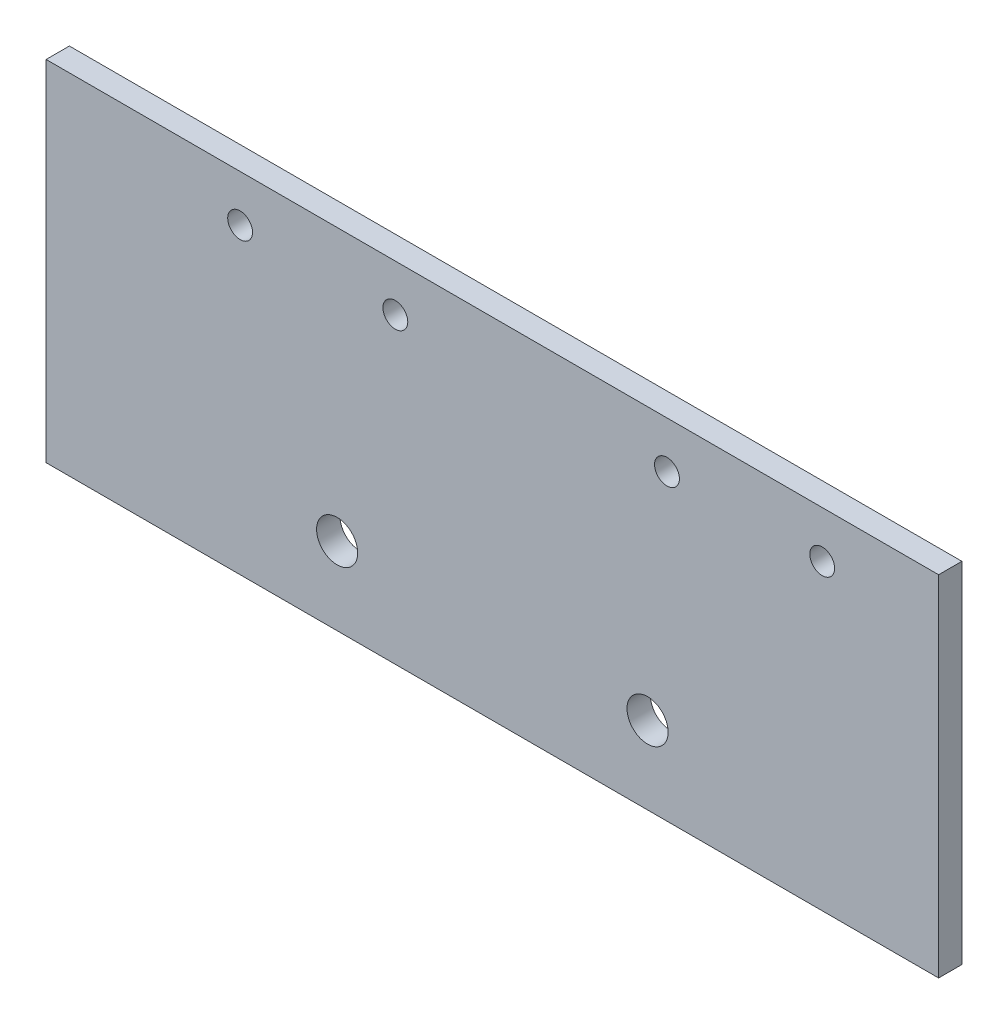
ISO-10303-21;
HEADER;
FILE_DESCRIPTION(('STEP AP214'),'2;1');
FILE_NAME('part.step','',(''),(''),'','','');
FILE_SCHEMA(('AUTOMOTIVE_DESIGN { 1 0 10303 214 1 1 1 1 }'));
ENDSEC;
DATA;
#1=APPLICATION_CONTEXT('core data for automotive mechanical design processes');
#2=APPLICATION_PROTOCOL_DEFINITION('international standard','automotive_design',2000,#1);
#3=PRODUCT_CONTEXT('',#1,'mechanical');
#4=PRODUCT('Part','Part','',(#3));
#5=PRODUCT_RELATED_PRODUCT_CATEGORY('part','',(#4));
#6=PRODUCT_DEFINITION_FORMATION('','',#4);
#7=PRODUCT_DEFINITION_CONTEXT('part definition',#1,'design');
#8=PRODUCT_DEFINITION('design','',#6,#7);
#9=PRODUCT_DEFINITION_SHAPE('','',#8);
#10=(LENGTH_UNIT() NAMED_UNIT(*) SI_UNIT(.MILLI.,.METRE.));
#11=(NAMED_UNIT(*) PLANE_ANGLE_UNIT() SI_UNIT($,.RADIAN.));
#12=(NAMED_UNIT(*) SI_UNIT($,.STERADIAN.) SOLID_ANGLE_UNIT());
#13=UNCERTAINTY_MEASURE_WITH_UNIT(LENGTH_MEASURE(1.E-05),#10,'distance_accuracy_value','');
#14=(GEOMETRIC_REPRESENTATION_CONTEXT(3) GLOBAL_UNCERTAINTY_ASSIGNED_CONTEXT((#13)) GLOBAL_UNIT_ASSIGNED_CONTEXT((#10,
#11,#12)) REPRESENTATION_CONTEXT('',''));
#15=CARTESIAN_POINT('',(0.,0.,0.));
#16=DIRECTION('',(0.,0.,1.));
#17=DIRECTION('',(1.,0.,0.));
#18=AXIS2_PLACEMENT_3D('',#15,#16,#17);
#19=CARTESIAN_POINT('',(0.,0.,3.));
#20=DIRECTION('',(0.,0.,1.));
#21=DIRECTION('',(1.,0.,0.));
#22=AXIS2_PLACEMENT_3D('',#19,#20,#21);
#23=PLANE('',#22);
#24=CARTESIAN_POINT('',(-252.,39.,3.));
#25=DIRECTION('',(0.,0.,1.));
#26=DIRECTION('',(1.,0.,0.));
#27=AXIS2_PLACEMENT_3D('',#24,#25,#26);
#28=CIRCLE('',#27,1.60000000000002);
#29=CARTESIAN_POINT('',(-250.4,39.,3.));
#30=VERTEX_POINT('',#29);
#31=EDGE_CURVE('E121',#30,#30,#28,.T.);
#32=ORIENTED_EDGE('',*,*,#31,.F.);
#33=EDGE_LOOP('',(#32));
#34=FACE_BOUND('',#33,.T.);
#35=CARTESIAN_POINT('',(-232.,39.,3.));
#36=DIRECTION('',(0.,0.,1.));
#37=DIRECTION('',(1.,0.,0.));
#38=AXIS2_PLACEMENT_3D('',#35,#36,#37);
#39=CIRCLE('',#38,1.59999999999999);
#40=CARTESIAN_POINT('',(-230.4,39.,3.));
#41=VERTEX_POINT('',#40);
#42=EDGE_CURVE('E115',#41,#41,#39,.T.);
#43=ORIENTED_EDGE('',*,*,#42,.F.);
#44=EDGE_LOOP('',(#43));
#45=FACE_BOUND('',#44,.T.);
#46=CARTESIAN_POINT('',(-177.,39.,3.));
#47=DIRECTION('',(0.,0.,1.));
#48=DIRECTION('',(1.,0.,0.));
#49=AXIS2_PLACEMENT_3D('',#46,#47,#48);
#50=CIRCLE('',#49,1.59999999999999);
#51=CARTESIAN_POINT('',(-175.4,39.,3.));
#52=VERTEX_POINT('',#51);
#53=EDGE_CURVE('E108',#52,#52,#50,.T.);
#54=ORIENTED_EDGE('',*,*,#53,.F.);
#55=EDGE_LOOP('',(#54));
#56=FACE_BOUND('',#55,.T.);
#57=CARTESIAN_POINT('',(-197.,39.,3.));
#58=DIRECTION('',(0.,0.,1.));
#59=DIRECTION('',(1.,0.,0.));
#60=AXIS2_PLACEMENT_3D('',#57,#58,#59);
#61=CIRCLE('',#60,1.59999999999999);
#62=CARTESIAN_POINT('',(-195.4,39.,3.));
#63=VERTEX_POINT('',#62);
#64=EDGE_CURVE('E111',#63,#63,#61,.T.);
#65=ORIENTED_EDGE('',*,*,#64,.F.);
#66=EDGE_LOOP('',(#65));
#67=FACE_BOUND('',#66,.T.);
#68=CARTESIAN_POINT('',(-239.5,9.99999999999995,3.));
#69=DIRECTION('',(0.,0.,1.));
#70=DIRECTION('',(1.,0.,0.));
#71=AXIS2_PLACEMENT_3D('',#68,#69,#70);
#72=CIRCLE('',#71,2.65000000000001);
#73=CARTESIAN_POINT('',(-236.85,9.99999999999995,3.));
#74=VERTEX_POINT('',#73);
#75=EDGE_CURVE('E146',#74,#74,#72,.T.);
#76=ORIENTED_EDGE('',*,*,#75,.F.);
#77=EDGE_LOOP('',(#76));
#78=FACE_BOUND('',#77,.T.);
#79=DIRECTION('',(-1.,0.,0.));
#80=VECTOR('',#79,1.);
#81=CARTESIAN_POINT('',(-257.,45.,3.));
#82=LINE('',#81,#80);
#83=CARTESIAN_POINT('',(-162.,45.,3.));
#84=VERTEX_POINT('',#83);
#85=CARTESIAN_POINT('',(-277.,45.,3.));
#86=VERTEX_POINT('',#85);
#87=EDGE_CURVE('E11',#84,#86,#82,.T.);
#88=ORIENTED_EDGE('',*,*,#87,.T.);
#89=DIRECTION('',(0.,-1.,0.));
#90=VECTOR('',#89,1.);
#91=CARTESIAN_POINT('',(-277.,45.,3.));
#92=LINE('',#91,#90);
#93=CARTESIAN_POINT('',(-277.,0.,3.));
#94=VERTEX_POINT('',#93);
#95=EDGE_CURVE('E88',#86,#94,#92,.T.);
#96=ORIENTED_EDGE('',*,*,#95,.T.);
#97=DIRECTION('',(1.,0.,0.));
#98=VECTOR('',#97,1.);
#99=CARTESIAN_POINT('',(-257.,0.,3.));
#100=LINE('',#99,#98);
#101=CARTESIAN_POINT('',(-162.,0.,3.));
#102=VERTEX_POINT('',#101);
#103=EDGE_CURVE('E52',#94,#102,#100,.T.);
#104=ORIENTED_EDGE('',*,*,#103,.T.);
#105=DIRECTION('',(0.,1.,0.));
#106=VECTOR('',#105,1.);
#107=CARTESIAN_POINT('',(-162.,45.,3.));
#108=LINE('',#107,#106);
#109=EDGE_CURVE('E90',#102,#84,#108,.T.);
#110=ORIENTED_EDGE('',*,*,#109,.T.);
#111=EDGE_LOOP('',(#88,#96,#104,#110));
#112=FACE_BOUND('',#111,.T.);
#113=CARTESIAN_POINT('',(-199.5,9.99999999999995,3.));
#114=DIRECTION('',(0.,0.,1.));
#115=DIRECTION('',(-1.,0.,0.));
#116=AXIS2_PLACEMENT_3D('',#113,#114,#115);
#117=CIRCLE('',#116,2.65000000000001);
#118=CARTESIAN_POINT('',(-202.15,9.99999999999995,3.));
#119=VERTEX_POINT('',#118);
#120=EDGE_CURVE('E140',#119,#119,#117,.T.);
#121=ORIENTED_EDGE('',*,*,#120,.F.);
#122=EDGE_LOOP('',(#121));
#123=FACE_BOUND('',#122,.T.);
#124=ADVANCED_FACE('F43',(#34,#45,#56,#67,#78,#112,#123),#23,.T.);
#125=CARTESIAN_POINT('',(0.,0.,0.));
#126=DIRECTION('',(0.,0.,1.));
#127=DIRECTION('',(1.,0.,0.));
#128=AXIS2_PLACEMENT_3D('',#125,#126,#127);
#129=PLANE('',#128);
#130=CARTESIAN_POINT('',(-252.,39.,0.));
#131=DIRECTION('',(0.,0.,1.));
#132=DIRECTION('',(1.,0.,0.));
#133=AXIS2_PLACEMENT_3D('',#130,#131,#132);
#134=CIRCLE('',#133,1.60000000000002);
#135=CARTESIAN_POINT('',(-250.4,39.,0.));
#136=VERTEX_POINT('',#135);
#137=EDGE_CURVE('E124',#136,#136,#134,.T.);
#138=ORIENTED_EDGE('',*,*,#137,.T.);
#139=EDGE_LOOP('',(#138));
#140=FACE_BOUND('',#139,.T.);
#141=CARTESIAN_POINT('',(-232.,39.,0.));
#142=DIRECTION('',(0.,0.,1.));
#143=DIRECTION('',(1.,0.,0.));
#144=AXIS2_PLACEMENT_3D('',#141,#142,#143);
#145=CIRCLE('',#144,1.59999999999999);
#146=CARTESIAN_POINT('',(-230.4,39.,0.));
#147=VERTEX_POINT('',#146);
#148=EDGE_CURVE('E118',#147,#147,#145,.T.);
#149=ORIENTED_EDGE('',*,*,#148,.T.);
#150=EDGE_LOOP('',(#149));
#151=FACE_BOUND('',#150,.T.);
#152=CARTESIAN_POINT('',(-177.,39.,0.));
#153=DIRECTION('',(0.,0.,1.));
#154=DIRECTION('',(1.,0.,0.));
#155=AXIS2_PLACEMENT_3D('',#152,#153,#154);
#156=CIRCLE('',#155,1.59999999999999);
#157=CARTESIAN_POINT('',(-175.4,39.,0.));
#158=VERTEX_POINT('',#157);
#159=EDGE_CURVE('E112',#158,#158,#156,.T.);
#160=ORIENTED_EDGE('',*,*,#159,.T.);
#161=EDGE_LOOP('',(#160));
#162=FACE_BOUND('',#161,.T.);
#163=CARTESIAN_POINT('',(-197.,39.,0.));
#164=DIRECTION('',(0.,0.,1.));
#165=DIRECTION('',(1.,0.,0.));
#166=AXIS2_PLACEMENT_3D('',#163,#164,#165);
#167=CIRCLE('',#166,1.59999999999999);
#168=CARTESIAN_POINT('',(-195.4,39.,0.));
#169=VERTEX_POINT('',#168);
#170=EDGE_CURVE('E127',#169,#169,#167,.T.);
#171=ORIENTED_EDGE('',*,*,#170,.T.);
#172=EDGE_LOOP('',(#171));
#173=FACE_BOUND('',#172,.T.);
#174=DIRECTION('',(1.,0.,0.));
#175=VECTOR('',#174,1.);
#176=CARTESIAN_POINT('',(-257.,0.,0.));
#177=LINE('',#176,#175);
#178=CARTESIAN_POINT('',(-277.,0.,0.));
#179=VERTEX_POINT('',#178);
#180=CARTESIAN_POINT('',(-162.,0.,0.));
#181=VERTEX_POINT('',#180);
#182=EDGE_CURVE('E67',#179,#181,#177,.T.);
#183=ORIENTED_EDGE('',*,*,#182,.F.);
#184=DIRECTION('',(0.,1.,0.));
#185=VECTOR('',#184,1.);
#186=CARTESIAN_POINT('',(-277.,45.,0.));
#187=LINE('',#186,#185);
#188=CARTESIAN_POINT('',(-277.,45.,0.));
#189=VERTEX_POINT('',#188);
#190=EDGE_CURVE('E106',#179,#189,#187,.T.);
#191=ORIENTED_EDGE('',*,*,#190,.T.);
#192=DIRECTION('',(-1.,0.,0.));
#193=VECTOR('',#192,1.);
#194=CARTESIAN_POINT('',(-257.,45.,0.));
#195=LINE('',#194,#193);
#196=CARTESIAN_POINT('',(-162.,45.,0.));
#197=VERTEX_POINT('',#196);
#198=EDGE_CURVE('E47',#197,#189,#195,.T.);
#199=ORIENTED_EDGE('',*,*,#198,.F.);
#200=DIRECTION('',(0.,-1.,0.));
#201=VECTOR('',#200,1.);
#202=CARTESIAN_POINT('',(-162.,45.,0.));
#203=LINE('',#202,#201);
#204=EDGE_CURVE('E132',#197,#181,#203,.T.);
#205=ORIENTED_EDGE('',*,*,#204,.T.);
#206=EDGE_LOOP('',(#183,#191,#199,#205));
#207=FACE_BOUND('',#206,.T.);
#208=CARTESIAN_POINT('',(-239.5,9.99999999999995,0.));
#209=DIRECTION('',(0.,0.,1.));
#210=DIRECTION('',(1.,0.,0.));
#211=AXIS2_PLACEMENT_3D('',#208,#209,#210);
#212=CIRCLE('',#211,2.65000000000001);
#213=CARTESIAN_POINT('',(-236.85,9.99999999999995,0.));
#214=VERTEX_POINT('',#213);
#215=EDGE_CURVE('E143',#214,#214,#212,.T.);
#216=ORIENTED_EDGE('',*,*,#215,.T.);
#217=EDGE_LOOP('',(#216));
#218=FACE_BOUND('',#217,.T.);
#219=CARTESIAN_POINT('',(-199.5,9.99999999999995,0.));
#220=DIRECTION('',(0.,0.,1.));
#221=DIRECTION('',(-1.,0.,0.));
#222=AXIS2_PLACEMENT_3D('',#219,#220,#221);
#223=CIRCLE('',#222,2.65000000000001);
#224=CARTESIAN_POINT('',(-202.15,9.99999999999995,0.));
#225=VERTEX_POINT('',#224);
#226=EDGE_CURVE('E134',#225,#225,#223,.T.);
#227=ORIENTED_EDGE('',*,*,#226,.T.);
#228=EDGE_LOOP('',(#227));
#229=FACE_BOUND('',#228,.T.);
#230=ADVANCED_FACE('F154',(#140,#151,#162,#173,#207,#218,#229),#129,.F.);
#231=CARTESIAN_POINT('',(-257.,0.,3.));
#232=DIRECTION('',(0.,1.,0.));
#233=DIRECTION('',(-1.,0.,0.));
#234=AXIS2_PLACEMENT_3D('',#231,#232,#233);
#235=PLANE('',#234);
#236=ORIENTED_EDGE('',*,*,#182,.T.);
#237=DIRECTION('',(0.,0.,1.));
#238=VECTOR('',#237,1.);
#239=CARTESIAN_POINT('',(-162.,0.,-49.2442890089805));
#240=LINE('',#239,#238);
#241=EDGE_CURVE('E137',#181,#102,#240,.T.);
#242=ORIENTED_EDGE('',*,*,#241,.T.);
#243=ORIENTED_EDGE('',*,*,#103,.F.);
#244=DIRECTION('',(0.,0.,1.));
#245=VECTOR('',#244,1.);
#246=CARTESIAN_POINT('',(-277.,0.,-49.2442890089805));
#247=LINE('',#246,#245);
#248=EDGE_CURVE('E99',#179,#94,#247,.T.);
#249=ORIENTED_EDGE('',*,*,#248,.F.);
#250=EDGE_LOOP('',(#236,#242,#243,#249));
#251=FACE_BOUND('',#250,.T.);
#252=ADVANCED_FACE('F45',(#251),#235,.F.);
#253=CARTESIAN_POINT('',(-257.,45.,3.));
#254=DIRECTION('',(0.,-1.,0.));
#255=DIRECTION('',(1.,0.,0.));
#256=AXIS2_PLACEMENT_3D('',#253,#254,#255);
#257=PLANE('',#256);
#258=ORIENTED_EDGE('',*,*,#198,.T.);
#259=DIRECTION('',(0.,0.,1.));
#260=VECTOR('',#259,1.);
#261=CARTESIAN_POINT('',(-277.,45.,-49.2442890089805));
#262=LINE('',#261,#260);
#263=EDGE_CURVE('E95',#189,#86,#262,.T.);
#264=ORIENTED_EDGE('',*,*,#263,.T.);
#265=ORIENTED_EDGE('',*,*,#87,.F.);
#266=DIRECTION('',(0.,0.,1.));
#267=VECTOR('',#266,1.);
#268=CARTESIAN_POINT('',(-162.,45.,-49.2442890089805));
#269=LINE('',#268,#267);
#270=EDGE_CURVE('E135',#197,#84,#269,.T.);
#271=ORIENTED_EDGE('',*,*,#270,.F.);
#272=EDGE_LOOP('',(#258,#264,#265,#271));
#273=FACE_BOUND('',#272,.T.);
#274=ADVANCED_FACE('F96',(#273),#257,.F.);
#275=CARTESIAN_POINT('',(-239.5,9.99999999999995,3.));
#276=DIRECTION('',(0.,0.,-1.));
#277=DIRECTION('',(-1.,0.,0.));
#278=AXIS2_PLACEMENT_3D('',#275,#276,#277);
#279=CYLINDRICAL_SURFACE('',#278,2.65000000000001);
#280=ORIENTED_EDGE('',*,*,#75,.T.);
#281=EDGE_LOOP('',(#280));
#282=FACE_BOUND('',#281,.T.);
#283=ORIENTED_EDGE('',*,*,#215,.F.);
#284=EDGE_LOOP('',(#283));
#285=FACE_BOUND('',#284,.T.);
#286=ADVANCED_FACE('F165',(#282,#285),#279,.F.);
#287=CARTESIAN_POINT('',(-199.5,9.99999999999995,3.));
#288=DIRECTION('',(0.,0.,-1.));
#289=DIRECTION('',(-1.,0.,0.));
#290=AXIS2_PLACEMENT_3D('',#287,#288,#289);
#291=CYLINDRICAL_SURFACE('',#290,2.65000000000001);
#292=ORIENTED_EDGE('',*,*,#120,.T.);
#293=EDGE_LOOP('',(#292));
#294=FACE_BOUND('',#293,.T.);
#295=ORIENTED_EDGE('',*,*,#226,.F.);
#296=EDGE_LOOP('',(#295));
#297=FACE_BOUND('',#296,.T.);
#298=ADVANCED_FACE('F163',(#294,#297),#291,.F.);
#299=CARTESIAN_POINT('',(-162.,45.,-49.2442890089805));
#300=DIRECTION('',(1.,0.,0.));
#301=DIRECTION('',(0.,0.,-1.));
#302=AXIS2_PLACEMENT_3D('',#299,#300,#301);
#303=PLANE('',#302);
#304=ORIENTED_EDGE('',*,*,#204,.F.);
#305=ORIENTED_EDGE('',*,*,#270,.T.);
#306=ORIENTED_EDGE('',*,*,#109,.F.);
#307=ORIENTED_EDGE('',*,*,#241,.F.);
#308=EDGE_LOOP('',(#304,#305,#306,#307));
#309=FACE_BOUND('',#308,.T.);
#310=ADVANCED_FACE('F153',(#309),#303,.T.);
#311=CARTESIAN_POINT('',(-197.,39.,0.));
#312=DIRECTION('',(0.,0.,1.));
#313=DIRECTION('',(1.,0.,0.));
#314=AXIS2_PLACEMENT_3D('',#311,#312,#313);
#315=CYLINDRICAL_SURFACE('',#314,1.59999999999999);
#316=ORIENTED_EDGE('',*,*,#170,.F.);
#317=EDGE_LOOP('',(#316));
#318=FACE_BOUND('',#317,.T.);
#319=ORIENTED_EDGE('',*,*,#64,.T.);
#320=EDGE_LOOP('',(#319));
#321=FACE_BOUND('',#320,.T.);
#322=ADVANCED_FACE('F172',(#318,#321),#315,.F.);
#323=CARTESIAN_POINT('',(-177.,39.,0.));
#324=DIRECTION('',(0.,0.,1.));
#325=DIRECTION('',(1.,0.,0.));
#326=AXIS2_PLACEMENT_3D('',#323,#324,#325);
#327=CYLINDRICAL_SURFACE('',#326,1.59999999999999);
#328=ORIENTED_EDGE('',*,*,#159,.F.);
#329=EDGE_LOOP('',(#328));
#330=FACE_BOUND('',#329,.T.);
#331=ORIENTED_EDGE('',*,*,#53,.T.);
#332=EDGE_LOOP('',(#331));
#333=FACE_BOUND('',#332,.T.);
#334=ADVANCED_FACE('F225',(#330,#333),#327,.F.);
#335=CARTESIAN_POINT('',(-232.,39.,0.));
#336=DIRECTION('',(0.,0.,1.));
#337=DIRECTION('',(1.,0.,0.));
#338=AXIS2_PLACEMENT_3D('',#335,#336,#337);
#339=CYLINDRICAL_SURFACE('',#338,1.59999999999999);
#340=ORIENTED_EDGE('',*,*,#148,.F.);
#341=EDGE_LOOP('',(#340));
#342=FACE_BOUND('',#341,.T.);
#343=ORIENTED_EDGE('',*,*,#42,.T.);
#344=EDGE_LOOP('',(#343));
#345=FACE_BOUND('',#344,.T.);
#346=ADVANCED_FACE('F214',(#342,#345),#339,.F.);
#347=CARTESIAN_POINT('',(-252.,39.,0.));
#348=DIRECTION('',(0.,0.,1.));
#349=DIRECTION('',(1.,0.,0.));
#350=AXIS2_PLACEMENT_3D('',#347,#348,#349);
#351=CYLINDRICAL_SURFACE('',#350,1.60000000000002);
#352=ORIENTED_EDGE('',*,*,#137,.F.);
#353=EDGE_LOOP('',(#352));
#354=FACE_BOUND('',#353,.T.);
#355=ORIENTED_EDGE('',*,*,#31,.T.);
#356=EDGE_LOOP('',(#355));
#357=FACE_BOUND('',#356,.T.);
#358=ADVANCED_FACE('F209',(#354,#357),#351,.F.);
#359=CARTESIAN_POINT('',(-277.,45.,-49.2442890089805));
#360=DIRECTION('',(-1.,0.,0.));
#361=DIRECTION('',(0.,0.,1.));
#362=AXIS2_PLACEMENT_3D('',#359,#360,#361);
#363=PLANE('',#362);
#364=ORIENTED_EDGE('',*,*,#190,.F.);
#365=ORIENTED_EDGE('',*,*,#248,.T.);
#366=ORIENTED_EDGE('',*,*,#95,.F.);
#367=ORIENTED_EDGE('',*,*,#263,.F.);
#368=EDGE_LOOP('',(#364,#365,#366,#367));
#369=FACE_BOUND('',#368,.T.);
#370=ADVANCED_FACE('F102',(#369),#363,.T.);
#371=CLOSED_SHELL('',(#124,#230,#252,#274,#286,#298,#310,#322,#334,#346,#358,#370));
#372=MANIFOLD_SOLID_BREP('B2',#371);
#373=ADVANCED_BREP_SHAPE_REPRESENTATION('',(#18,#372),#14);
#374=SHAPE_DEFINITION_REPRESENTATION(#9,#373);
ENDSEC;
END-ISO-10303-21;
